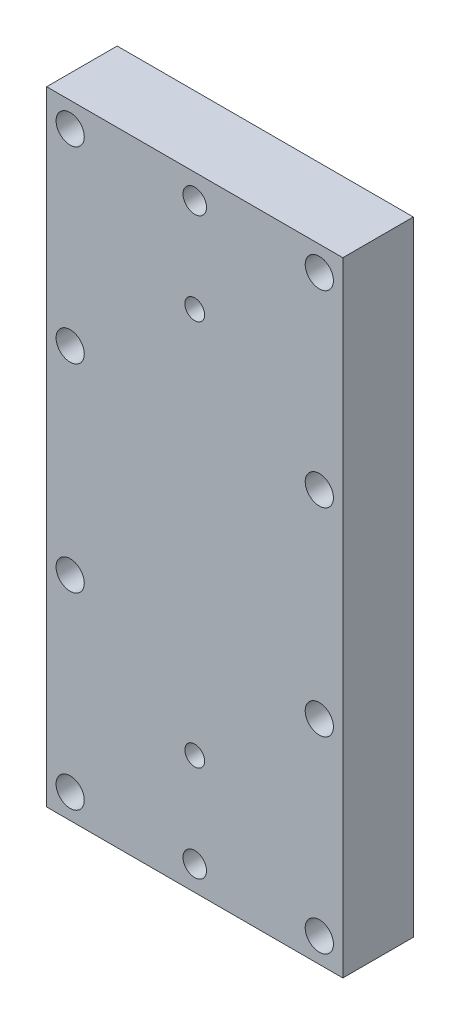
ISO-10303-21;
HEADER;
FILE_DESCRIPTION(('STEP AP214'),'2;1');
FILE_NAME('part.step','',(''),(''),'','','');
FILE_SCHEMA(('AUTOMOTIVE_DESIGN { 1 0 10303 214 1 1 1 1 }'));
ENDSEC;
DATA;
#1=APPLICATION_CONTEXT('core data for automotive mechanical design processes');
#2=APPLICATION_PROTOCOL_DEFINITION('international standard','automotive_design',2000,#1);
#3=PRODUCT_CONTEXT('',#1,'mechanical');
#4=PRODUCT('Part','Part','',(#3));
#5=PRODUCT_RELATED_PRODUCT_CATEGORY('part','',(#4));
#6=PRODUCT_DEFINITION_FORMATION('','',#4);
#7=PRODUCT_DEFINITION_CONTEXT('part definition',#1,'design');
#8=PRODUCT_DEFINITION('design','',#6,#7);
#9=PRODUCT_DEFINITION_SHAPE('','',#8);
#10=(LENGTH_UNIT() NAMED_UNIT(*) SI_UNIT(.MILLI.,.METRE.));
#11=(NAMED_UNIT(*) PLANE_ANGLE_UNIT() SI_UNIT($,.RADIAN.));
#12=(NAMED_UNIT(*) SI_UNIT($,.STERADIAN.) SOLID_ANGLE_UNIT());
#13=UNCERTAINTY_MEASURE_WITH_UNIT(LENGTH_MEASURE(1.E-05),#10,'distance_accuracy_value','');
#14=(GEOMETRIC_REPRESENTATION_CONTEXT(3) GLOBAL_UNCERTAINTY_ASSIGNED_CONTEXT((#13)) GLOBAL_UNIT_ASSIGNED_CONTEXT((#10,
#11,#12)) REPRESENTATION_CONTEXT('',''));
#15=CARTESIAN_POINT('',(0.,0.,0.));
#16=DIRECTION('',(0.,0.,1.));
#17=DIRECTION('',(1.,0.,0.));
#18=AXIS2_PLACEMENT_3D('',#15,#16,#17);
#19=CARTESIAN_POINT('',(26.5,102.2,161.895507079012));
#20=DIRECTION('',(0.,0.,-1.));
#21=DIRECTION('',(-1.,0.,0.));
#22=AXIS2_PLACEMENT_3D('',#19,#20,#21);
#23=CYLINDRICAL_SURFACE('',#22,3.);
#24=CARTESIAN_POINT('',(26.5,102.2,0.));
#25=DIRECTION('',(0.,0.,1.));
#26=DIRECTION('',(1.,0.,0.));
#27=AXIS2_PLACEMENT_3D('',#24,#25,#26);
#28=CIRCLE('',#27,3.);
#29=CARTESIAN_POINT('',(29.5,102.2,0.));
#30=VERTEX_POINT('',#29);
#31=EDGE_CURVE('E114',#30,#30,#28,.T.);
#32=ORIENTED_EDGE('',*,*,#31,.F.);
#33=EDGE_LOOP('',(#32));
#34=FACE_BOUND('',#33,.T.);
#35=CARTESIAN_POINT('',(26.5,102.2,15.));
#36=DIRECTION('',(0.,0.,1.));
#37=DIRECTION('',(1.,0.,0.));
#38=AXIS2_PLACEMENT_3D('',#35,#36,#37);
#39=CIRCLE('',#38,3.);
#40=CARTESIAN_POINT('',(29.5,102.2,15.));
#41=VERTEX_POINT('',#40);
#42=EDGE_CURVE('E140',#41,#41,#39,.T.);
#43=ORIENTED_EDGE('',*,*,#42,.T.);
#44=EDGE_LOOP('',(#43));
#45=FACE_BOUND('',#44,.T.);
#46=ADVANCED_FACE('F41',(#34,#45),#23,.F.);
#47=CARTESIAN_POINT('',(26.5,62.2,161.895507079012));
#48=DIRECTION('',(0.,0.,-1.));
#49=DIRECTION('',(-1.,0.,0.));
#50=AXIS2_PLACEMENT_3D('',#47,#48,#49);
#51=CYLINDRICAL_SURFACE('',#50,3.);
#52=CARTESIAN_POINT('',(26.5,62.2,0.));
#53=DIRECTION('',(0.,0.,1.));
#54=DIRECTION('',(1.,0.,0.));
#55=AXIS2_PLACEMENT_3D('',#52,#53,#54);
#56=CIRCLE('',#55,3.);
#57=CARTESIAN_POINT('',(29.5,62.2,0.));
#58=VERTEX_POINT('',#57);
#59=EDGE_CURVE('E117',#58,#58,#56,.T.);
#60=ORIENTED_EDGE('',*,*,#59,.F.);
#61=EDGE_LOOP('',(#60));
#62=FACE_BOUND('',#61,.T.);
#63=CARTESIAN_POINT('',(26.5,62.2,15.));
#64=DIRECTION('',(0.,0.,1.));
#65=DIRECTION('',(1.,0.,0.));
#66=AXIS2_PLACEMENT_3D('',#63,#64,#65);
#67=CIRCLE('',#66,3.);
#68=CARTESIAN_POINT('',(29.5,62.2,15.));
#69=VERTEX_POINT('',#68);
#70=EDGE_CURVE('E143',#69,#69,#67,.T.);
#71=ORIENTED_EDGE('',*,*,#70,.T.);
#72=EDGE_LOOP('',(#71));
#73=FACE_BOUND('',#72,.T.);
#74=ADVANCED_FACE('F231',(#62,#73),#51,.F.);
#75=CARTESIAN_POINT('',(-26.5,62.2,161.895507079012));
#76=DIRECTION('',(0.,0.,-1.));
#77=DIRECTION('',(-1.,0.,0.));
#78=AXIS2_PLACEMENT_3D('',#75,#76,#77);
#79=CYLINDRICAL_SURFACE('',#78,3.);
#80=CARTESIAN_POINT('',(-26.5,62.2,0.));
#81=DIRECTION('',(0.,0.,1.));
#82=DIRECTION('',(1.,0.,0.));
#83=AXIS2_PLACEMENT_3D('',#80,#81,#82);
#84=CIRCLE('',#83,3.);
#85=CARTESIAN_POINT('',(-23.5,62.2,0.));
#86=VERTEX_POINT('',#85);
#87=EDGE_CURVE('E122',#86,#86,#84,.T.);
#88=ORIENTED_EDGE('',*,*,#87,.F.);
#89=EDGE_LOOP('',(#88));
#90=FACE_BOUND('',#89,.T.);
#91=CARTESIAN_POINT('',(-26.5,62.2,15.));
#92=DIRECTION('',(0.,0.,1.));
#93=DIRECTION('',(1.,0.,0.));
#94=AXIS2_PLACEMENT_3D('',#91,#92,#93);
#95=CIRCLE('',#94,3.);
#96=CARTESIAN_POINT('',(-23.5,62.2,15.));
#97=VERTEX_POINT('',#96);
#98=EDGE_CURVE('E146',#97,#97,#95,.T.);
#99=ORIENTED_EDGE('',*,*,#98,.T.);
#100=EDGE_LOOP('',(#99));
#101=FACE_BOUND('',#100,.T.);
#102=ADVANCED_FACE('F237',(#90,#101),#79,.F.);
#103=CARTESIAN_POINT('',(-26.5,102.2,161.895507079012));
#104=DIRECTION('',(0.,0.,-1.));
#105=DIRECTION('',(-1.,0.,0.));
#106=AXIS2_PLACEMENT_3D('',#103,#104,#105);
#107=CYLINDRICAL_SURFACE('',#106,3.);
#108=CARTESIAN_POINT('',(-26.5,102.2,0.));
#109=DIRECTION('',(0.,0.,1.));
#110=DIRECTION('',(1.,0.,0.));
#111=AXIS2_PLACEMENT_3D('',#108,#109,#110);
#112=CIRCLE('',#111,3.);
#113=CARTESIAN_POINT('',(-23.5,102.2,0.));
#114=VERTEX_POINT('',#113);
#115=EDGE_CURVE('E125',#114,#114,#112,.T.);
#116=ORIENTED_EDGE('',*,*,#115,.F.);
#117=EDGE_LOOP('',(#116));
#118=FACE_BOUND('',#117,.T.);
#119=CARTESIAN_POINT('',(-26.5,102.2,15.));
#120=DIRECTION('',(0.,0.,1.));
#121=DIRECTION('',(1.,0.,0.));
#122=AXIS2_PLACEMENT_3D('',#119,#120,#121);
#123=CIRCLE('',#122,3.);
#124=CARTESIAN_POINT('',(-23.5,102.2,15.));
#125=VERTEX_POINT('',#124);
#126=EDGE_CURVE('E149',#125,#125,#123,.T.);
#127=ORIENTED_EDGE('',*,*,#126,.T.);
#128=EDGE_LOOP('',(#127));
#129=FACE_BOUND('',#128,.T.);
#130=ADVANCED_FACE('F247',(#118,#129),#107,.F.);
#131=CARTESIAN_POINT('',(26.5,20.,161.895507079012));
#132=DIRECTION('',(0.,0.,-1.));
#133=DIRECTION('',(-1.,0.,0.));
#134=AXIS2_PLACEMENT_3D('',#131,#132,#133);
#135=CYLINDRICAL_SURFACE('',#134,3.);
#136=CARTESIAN_POINT('',(26.5,20.,0.));
#137=DIRECTION('',(0.,0.,1.));
#138=DIRECTION('',(1.,0.,0.));
#139=AXIS2_PLACEMENT_3D('',#136,#137,#138);
#140=CIRCLE('',#139,3.);
#141=CARTESIAN_POINT('',(29.5,20.,0.));
#142=VERTEX_POINT('',#141);
#143=EDGE_CURVE('E128',#142,#142,#140,.T.);
#144=ORIENTED_EDGE('',*,*,#143,.F.);
#145=EDGE_LOOP('',(#144));
#146=FACE_BOUND('',#145,.T.);
#147=CARTESIAN_POINT('',(26.5,20.,15.));
#148=DIRECTION('',(0.,0.,1.));
#149=DIRECTION('',(1.,0.,0.));
#150=AXIS2_PLACEMENT_3D('',#147,#148,#149);
#151=CIRCLE('',#150,3.);
#152=CARTESIAN_POINT('',(29.5,20.,15.));
#153=VERTEX_POINT('',#152);
#154=EDGE_CURVE('E152',#153,#153,#151,.T.);
#155=ORIENTED_EDGE('',*,*,#154,.T.);
#156=EDGE_LOOP('',(#155));
#157=FACE_BOUND('',#156,.T.);
#158=ADVANCED_FACE('F251',(#146,#157),#135,.F.);
#159=CARTESIAN_POINT('',(26.5,-20.,161.895507079012));
#160=DIRECTION('',(0.,0.,-1.));
#161=DIRECTION('',(-1.,0.,0.));
#162=AXIS2_PLACEMENT_3D('',#159,#160,#161);
#163=CYLINDRICAL_SURFACE('',#162,3.);
#164=CARTESIAN_POINT('',(26.5,-20.,0.));
#165=DIRECTION('',(0.,0.,1.));
#166=DIRECTION('',(1.,0.,0.));
#167=AXIS2_PLACEMENT_3D('',#164,#165,#166);
#168=CIRCLE('',#167,3.);
#169=CARTESIAN_POINT('',(29.5,-20.,0.));
#170=VERTEX_POINT('',#169);
#171=EDGE_CURVE('E131',#170,#170,#168,.T.);
#172=ORIENTED_EDGE('',*,*,#171,.F.);
#173=EDGE_LOOP('',(#172));
#174=FACE_BOUND('',#173,.T.);
#175=CARTESIAN_POINT('',(26.5,-20.,15.));
#176=DIRECTION('',(0.,0.,1.));
#177=DIRECTION('',(1.,0.,0.));
#178=AXIS2_PLACEMENT_3D('',#175,#176,#177);
#179=CIRCLE('',#178,3.);
#180=CARTESIAN_POINT('',(29.5,-20.,15.));
#181=VERTEX_POINT('',#180);
#182=EDGE_CURVE('E155',#181,#181,#179,.T.);
#183=ORIENTED_EDGE('',*,*,#182,.T.);
#184=EDGE_LOOP('',(#183));
#185=FACE_BOUND('',#184,.T.);
#186=ADVANCED_FACE('F227',(#174,#185),#163,.F.);
#187=CARTESIAN_POINT('',(-26.5,-20.,161.895507079012));
#188=DIRECTION('',(0.,0.,-1.));
#189=DIRECTION('',(-1.,0.,0.));
#190=AXIS2_PLACEMENT_3D('',#187,#188,#189);
#191=CYLINDRICAL_SURFACE('',#190,3.);
#192=CARTESIAN_POINT('',(-26.5,-20.,0.));
#193=DIRECTION('',(0.,0.,1.));
#194=DIRECTION('',(1.,0.,0.));
#195=AXIS2_PLACEMENT_3D('',#192,#193,#194);
#196=CIRCLE('',#195,3.);
#197=CARTESIAN_POINT('',(-23.5,-20.,0.));
#198=VERTEX_POINT('',#197);
#199=EDGE_CURVE('E134',#198,#198,#196,.T.);
#200=ORIENTED_EDGE('',*,*,#199,.F.);
#201=EDGE_LOOP('',(#200));
#202=FACE_BOUND('',#201,.T.);
#203=CARTESIAN_POINT('',(-26.5,-20.,15.));
#204=DIRECTION('',(0.,0.,1.));
#205=DIRECTION('',(1.,0.,0.));
#206=AXIS2_PLACEMENT_3D('',#203,#204,#205);
#207=CIRCLE('',#206,3.);
#208=CARTESIAN_POINT('',(-23.5,-20.,15.));
#209=VERTEX_POINT('',#208);
#210=EDGE_CURVE('E158',#209,#209,#207,.T.);
#211=ORIENTED_EDGE('',*,*,#210,.T.);
#212=EDGE_LOOP('',(#211));
#213=FACE_BOUND('',#212,.T.);
#214=ADVANCED_FACE('F219',(#202,#213),#191,.F.);
#215=CARTESIAN_POINT('',(-26.5,20.,161.895507079012));
#216=DIRECTION('',(0.,0.,-1.));
#217=DIRECTION('',(-1.,0.,0.));
#218=AXIS2_PLACEMENT_3D('',#215,#216,#217);
#219=CYLINDRICAL_SURFACE('',#218,3.);
#220=CARTESIAN_POINT('',(-26.5,20.,0.));
#221=DIRECTION('',(0.,0.,1.));
#222=DIRECTION('',(1.,0.,0.));
#223=AXIS2_PLACEMENT_3D('',#220,#221,#222);
#224=CIRCLE('',#223,3.);
#225=CARTESIAN_POINT('',(-23.5,20.,0.));
#226=VERTEX_POINT('',#225);
#227=EDGE_CURVE('E137',#226,#226,#224,.T.);
#228=ORIENTED_EDGE('',*,*,#227,.F.);
#229=EDGE_LOOP('',(#228));
#230=FACE_BOUND('',#229,.T.);
#231=CARTESIAN_POINT('',(-26.5,20.,15.));
#232=DIRECTION('',(0.,0.,1.));
#233=DIRECTION('',(1.,0.,0.));
#234=AXIS2_PLACEMENT_3D('',#231,#232,#233);
#235=CIRCLE('',#234,3.);
#236=CARTESIAN_POINT('',(-23.5,20.,15.));
#237=VERTEX_POINT('',#236);
#238=EDGE_CURVE('E87',#237,#237,#235,.T.);
#239=ORIENTED_EDGE('',*,*,#238,.T.);
#240=EDGE_LOOP('',(#239));
#241=FACE_BOUND('',#240,.T.);
#242=ADVANCED_FACE('F43',(#230,#241),#219,.F.);
#243=CARTESIAN_POINT('',(0.,0.,0.));
#244=DIRECTION('',(0.,0.,1.));
#245=DIRECTION('',(1.,0.,0.));
#246=AXIS2_PLACEMENT_3D('',#243,#244,#245);
#247=PLANE('',#246);
#248=CARTESIAN_POINT('',(0.,102.2,0.));
#249=DIRECTION('',(0.,0.,1.));
#250=DIRECTION('',(1.,0.,0.));
#251=AXIS2_PLACEMENT_3D('',#248,#249,#250);
#252=CIRCLE('',#251,2.49999999999999);
#253=CARTESIAN_POINT('',(2.50000000000001,102.2,0.));
#254=VERTEX_POINT('',#253);
#255=EDGE_CURVE('E183',#254,#254,#252,.T.);
#256=ORIENTED_EDGE('',*,*,#255,.T.);
#257=EDGE_LOOP('',(#256));
#258=FACE_BOUND('',#257,.T.);
#259=CARTESIAN_POINT('',(0.,-20.,0.));
#260=DIRECTION('',(0.,0.,1.));
#261=DIRECTION('',(1.,0.,0.));
#262=AXIS2_PLACEMENT_3D('',#259,#260,#261);
#263=CIRCLE('',#262,2.49999999999999);
#264=CARTESIAN_POINT('',(2.5,-20.,0.));
#265=VERTEX_POINT('',#264);
#266=EDGE_CURVE('E177',#265,#265,#263,.T.);
#267=ORIENTED_EDGE('',*,*,#266,.T.);
#268=EDGE_LOOP('',(#267));
#269=FACE_BOUND('',#268,.T.);
#270=CARTESIAN_POINT('',(1.40512601554121E-13,82.1999999999995,0.));
#271=DIRECTION('',(0.,0.,1.));
#272=DIRECTION('',(1.,0.,0.));
#273=AXIS2_PLACEMENT_3D('',#270,#271,#272);
#274=CIRCLE('',#273,2.09999999999999);
#275=CARTESIAN_POINT('',(2.10000000000013,82.1999999999995,0.));
#276=VERTEX_POINT('',#275);
#277=EDGE_CURVE('E171',#276,#276,#274,.T.);
#278=ORIENTED_EDGE('',*,*,#277,.T.);
#279=EDGE_LOOP('',(#278));
#280=FACE_BOUND('',#279,.T.);
#281=CARTESIAN_POINT('',(1.31838984174237E-13,-4.85722573273506E-13,0.));
#282=DIRECTION('',(0.,0.,1.));
#283=DIRECTION('',(1.,0.,0.));
#284=AXIS2_PLACEMENT_3D('',#281,#282,#283);
#285=CIRCLE('',#284,2.09999999999999);
#286=CARTESIAN_POINT('',(2.10000000000012,-4.85722573273506E-13,0.));
#287=VERTEX_POINT('',#286);
#288=EDGE_CURVE('E165',#287,#287,#285,.T.);
#289=ORIENTED_EDGE('',*,*,#288,.T.);
#290=EDGE_LOOP('',(#289));
#291=FACE_BOUND('',#290,.T.);
#292=ORIENTED_EDGE('',*,*,#227,.T.);
#293=EDGE_LOOP('',(#292));
#294=FACE_BOUND('',#293,.T.);
#295=ORIENTED_EDGE('',*,*,#199,.T.);
#296=EDGE_LOOP('',(#295));
#297=FACE_BOUND('',#296,.T.);
#298=ORIENTED_EDGE('',*,*,#171,.T.);
#299=EDGE_LOOP('',(#298));
#300=FACE_BOUND('',#299,.T.);
#301=ORIENTED_EDGE('',*,*,#143,.T.);
#302=EDGE_LOOP('',(#301));
#303=FACE_BOUND('',#302,.T.);
#304=ORIENTED_EDGE('',*,*,#115,.T.);
#305=EDGE_LOOP('',(#304));
#306=FACE_BOUND('',#305,.T.);
#307=ORIENTED_EDGE('',*,*,#87,.T.);
#308=EDGE_LOOP('',(#307));
#309=FACE_BOUND('',#308,.T.);
#310=ORIENTED_EDGE('',*,*,#59,.T.);
#311=EDGE_LOOP('',(#310));
#312=FACE_BOUND('',#311,.T.);
#313=ORIENTED_EDGE('',*,*,#31,.T.);
#314=EDGE_LOOP('',(#313));
#315=FACE_BOUND('',#314,.T.);
#316=DIRECTION('',(-1.,0.,0.));
#317=VECTOR('',#316,1.);
#318=CARTESIAN_POINT('',(0.,107.45,0.));
#319=LINE('',#318,#317);
#320=CARTESIAN_POINT('',(31.5,107.45,0.));
#321=VERTEX_POINT('',#320);
#322=CARTESIAN_POINT('',(-31.5,107.45,0.));
#323=VERTEX_POINT('',#322);
#324=EDGE_CURVE('E111',#321,#323,#319,.T.);
#325=ORIENTED_EDGE('',*,*,#324,.F.);
#326=DIRECTION('',(0.,-1.,0.));
#327=VECTOR('',#326,1.);
#328=CARTESIAN_POINT('',(31.5,0.,0.));
#329=LINE('',#328,#327);
#330=CARTESIAN_POINT('',(31.5,-25.25,0.));
#331=VERTEX_POINT('',#330);
#332=EDGE_CURVE('E93',#321,#331,#329,.T.);
#333=ORIENTED_EDGE('',*,*,#332,.T.);
#334=DIRECTION('',(-1.,0.,0.));
#335=VECTOR('',#334,1.);
#336=CARTESIAN_POINT('',(0.,-25.25,0.));
#337=LINE('',#336,#335);
#338=CARTESIAN_POINT('',(-31.5,-25.25,0.));
#339=VERTEX_POINT('',#338);
#340=EDGE_CURVE('E98',#331,#339,#337,.T.);
#341=ORIENTED_EDGE('',*,*,#340,.T.);
#342=DIRECTION('',(0.,-1.,0.));
#343=VECTOR('',#342,1.);
#344=CARTESIAN_POINT('',(-31.5,0.,0.));
#345=LINE('',#344,#343);
#346=EDGE_CURVE('E107',#323,#339,#345,.T.);
#347=ORIENTED_EDGE('',*,*,#346,.F.);
#348=EDGE_LOOP('',(#325,#333,#341,#347));
#349=FACE_BOUND('',#348,.T.);
#350=ADVANCED_FACE('F110',(#258,#269,#280,#291,#294,#297,#300,#303,#306,#309,#312,#315,#349),
#247,.F.);
#351=CARTESIAN_POINT('',(31.5,0.,161.895507079012));
#352=DIRECTION('',(1.,0.,0.));
#353=DIRECTION('',(0.,0.,-1.));
#354=AXIS2_PLACEMENT_3D('',#351,#352,#353);
#355=PLANE('',#354);
#356=DIRECTION('',(0.,0.,-1.));
#357=VECTOR('',#356,1.);
#358=CARTESIAN_POINT('',(31.5,107.45,161.895507079012));
#359=LINE('',#358,#357);
#360=CARTESIAN_POINT('',(31.5,107.45,15.));
#361=VERTEX_POINT('',#360);
#362=EDGE_CURVE('E64',#361,#321,#359,.T.);
#363=ORIENTED_EDGE('',*,*,#362,.F.);
#364=DIRECTION('',(0.,-1.,0.));
#365=VECTOR('',#364,1.);
#366=CARTESIAN_POINT('',(31.5,0.,15.));
#367=LINE('',#366,#365);
#368=CARTESIAN_POINT('',(31.5,-25.25,15.));
#369=VERTEX_POINT('',#368);
#370=EDGE_CURVE('E11',#361,#369,#367,.T.);
#371=ORIENTED_EDGE('',*,*,#370,.T.);
#372=DIRECTION('',(0.,0.,-1.));
#373=VECTOR('',#372,1.);
#374=CARTESIAN_POINT('',(31.5,-25.25,161.895507079012));
#375=LINE('',#374,#373);
#376=EDGE_CURVE('E94',#369,#331,#375,.T.);
#377=ORIENTED_EDGE('',*,*,#376,.T.);
#378=ORIENTED_EDGE('',*,*,#332,.F.);
#379=EDGE_LOOP('',(#363,#371,#377,#378));
#380=FACE_BOUND('',#379,.T.);
#381=ADVANCED_FACE('F91',(#380),#355,.T.);
#382=CARTESIAN_POINT('',(0.,-25.25,161.895507079012));
#383=DIRECTION('',(0.,-1.,0.));
#384=DIRECTION('',(0.,0.,-1.));
#385=AXIS2_PLACEMENT_3D('',#382,#383,#384);
#386=PLANE('',#385);
#387=ORIENTED_EDGE('',*,*,#376,.F.);
#388=DIRECTION('',(-1.,0.,0.));
#389=VECTOR('',#388,1.);
#390=CARTESIAN_POINT('',(0.,-25.25,15.));
#391=LINE('',#390,#389);
#392=CARTESIAN_POINT('',(-31.5,-25.25,15.));
#393=VERTEX_POINT('',#392);
#394=EDGE_CURVE('E56',#369,#393,#391,.T.);
#395=ORIENTED_EDGE('',*,*,#394,.T.);
#396=DIRECTION('',(0.,0.,-1.));
#397=VECTOR('',#396,1.);
#398=CARTESIAN_POINT('',(-31.5,-25.25,161.895507079012));
#399=LINE('',#398,#397);
#400=EDGE_CURVE('E96',#393,#339,#399,.T.);
#401=ORIENTED_EDGE('',*,*,#400,.T.);
#402=ORIENTED_EDGE('',*,*,#340,.F.);
#403=EDGE_LOOP('',(#387,#395,#401,#402));
#404=FACE_BOUND('',#403,.T.);
#405=ADVANCED_FACE('F296',(#404),#386,.T.);
#406=CARTESIAN_POINT('',(-31.5,0.,161.895507079012));
#407=DIRECTION('',(1.,0.,0.));
#408=DIRECTION('',(0.,0.,-1.));
#409=AXIS2_PLACEMENT_3D('',#406,#407,#408);
#410=PLANE('',#409);
#411=DIRECTION('',(0.,-1.,0.));
#412=VECTOR('',#411,1.);
#413=CARTESIAN_POINT('',(-31.5,0.,15.));
#414=LINE('',#413,#412);
#415=CARTESIAN_POINT('',(-31.5,107.45,15.));
#416=VERTEX_POINT('',#415);
#417=EDGE_CURVE('E88',#416,#393,#414,.T.);
#418=ORIENTED_EDGE('',*,*,#417,.F.);
#419=DIRECTION('',(0.,0.,-1.));
#420=VECTOR('',#419,1.);
#421=CARTESIAN_POINT('',(-31.5,107.45,161.895507079012));
#422=LINE('',#421,#420);
#423=EDGE_CURVE('E49',#416,#323,#422,.T.);
#424=ORIENTED_EDGE('',*,*,#423,.T.);
#425=ORIENTED_EDGE('',*,*,#346,.T.);
#426=ORIENTED_EDGE('',*,*,#400,.F.);
#427=EDGE_LOOP('',(#418,#424,#425,#426));
#428=FACE_BOUND('',#427,.T.);
#429=ADVANCED_FACE('F105',(#428),#410,.F.);
#430=CARTESIAN_POINT('',(0.,107.45,161.895507079012));
#431=DIRECTION('',(0.,-1.,0.));
#432=DIRECTION('',(0.,0.,-1.));
#433=AXIS2_PLACEMENT_3D('',#430,#431,#432);
#434=PLANE('',#433);
#435=DIRECTION('',(-1.,0.,0.));
#436=VECTOR('',#435,1.);
#437=CARTESIAN_POINT('',(0.,107.45,15.));
#438=LINE('',#437,#436);
#439=EDGE_CURVE('E82',#361,#416,#438,.T.);
#440=ORIENTED_EDGE('',*,*,#439,.F.);
#441=ORIENTED_EDGE('',*,*,#362,.T.);
#442=ORIENTED_EDGE('',*,*,#324,.T.);
#443=ORIENTED_EDGE('',*,*,#423,.F.);
#444=EDGE_LOOP('',(#440,#441,#442,#443));
#445=FACE_BOUND('',#444,.T.);
#446=ADVANCED_FACE('F85',(#445),#434,.F.);
#447=CARTESIAN_POINT('',(-11.2182809979644,45.6118133743666,15.));
#448=DIRECTION('',(0.,0.,1.));
#449=DIRECTION('',(1.,0.,0.));
#450=AXIS2_PLACEMENT_3D('',#447,#448,#449);
#451=PLANE('',#450);
#452=CARTESIAN_POINT('',(0.,102.2,15.));
#453=DIRECTION('',(0.,0.,1.));
#454=DIRECTION('',(1.,0.,0.));
#455=AXIS2_PLACEMENT_3D('',#452,#453,#454);
#456=CIRCLE('',#455,2.49999999999999);
#457=CARTESIAN_POINT('',(2.50000000000001,102.2,15.));
#458=VERTEX_POINT('',#457);
#459=EDGE_CURVE('E186',#458,#458,#456,.T.);
#460=ORIENTED_EDGE('',*,*,#459,.F.);
#461=EDGE_LOOP('',(#460));
#462=FACE_BOUND('',#461,.T.);
#463=CARTESIAN_POINT('',(0.,-20.,15.));
#464=DIRECTION('',(0.,0.,1.));
#465=DIRECTION('',(1.,0.,0.));
#466=AXIS2_PLACEMENT_3D('',#463,#464,#465);
#467=CIRCLE('',#466,2.49999999999999);
#468=CARTESIAN_POINT('',(2.49999999999999,-20.,15.));
#469=VERTEX_POINT('',#468);
#470=EDGE_CURVE('E180',#469,#469,#467,.T.);
#471=ORIENTED_EDGE('',*,*,#470,.F.);
#472=EDGE_LOOP('',(#471));
#473=FACE_BOUND('',#472,.T.);
#474=CARTESIAN_POINT('',(1.40512601554121E-13,82.1999999999995,15.));
#475=DIRECTION('',(0.,0.,1.));
#476=DIRECTION('',(1.,0.,0.));
#477=AXIS2_PLACEMENT_3D('',#474,#475,#476);
#478=CIRCLE('',#477,2.09999999999999);
#479=CARTESIAN_POINT('',(2.10000000000013,82.1999999999995,15.));
#480=VERTEX_POINT('',#479);
#481=EDGE_CURVE('E174',#480,#480,#478,.T.);
#482=ORIENTED_EDGE('',*,*,#481,.F.);
#483=EDGE_LOOP('',(#482));
#484=FACE_BOUND('',#483,.T.);
#485=CARTESIAN_POINT('',(1.31838984174237E-13,-4.85722573273506E-13,15.));
#486=DIRECTION('',(0.,0.,1.));
#487=DIRECTION('',(1.,0.,0.));
#488=AXIS2_PLACEMENT_3D('',#485,#486,#487);
#489=CIRCLE('',#488,2.09999999999999);
#490=CARTESIAN_POINT('',(2.10000000000012,-4.85722573273506E-13,15.));
#491=VERTEX_POINT('',#490);
#492=EDGE_CURVE('E168',#491,#491,#489,.T.);
#493=ORIENTED_EDGE('',*,*,#492,.F.);
#494=EDGE_LOOP('',(#493));
#495=FACE_BOUND('',#494,.T.);
#496=ORIENTED_EDGE('',*,*,#42,.F.);
#497=EDGE_LOOP('',(#496));
#498=FACE_BOUND('',#497,.T.);
#499=ORIENTED_EDGE('',*,*,#70,.F.);
#500=EDGE_LOOP('',(#499));
#501=FACE_BOUND('',#500,.T.);
#502=ORIENTED_EDGE('',*,*,#98,.F.);
#503=EDGE_LOOP('',(#502));
#504=FACE_BOUND('',#503,.T.);
#505=ORIENTED_EDGE('',*,*,#126,.F.);
#506=EDGE_LOOP('',(#505));
#507=FACE_BOUND('',#506,.T.);
#508=ORIENTED_EDGE('',*,*,#154,.F.);
#509=EDGE_LOOP('',(#508));
#510=FACE_BOUND('',#509,.T.);
#511=ORIENTED_EDGE('',*,*,#182,.F.);
#512=EDGE_LOOP('',(#511));
#513=FACE_BOUND('',#512,.T.);
#514=ORIENTED_EDGE('',*,*,#210,.F.);
#515=EDGE_LOOP('',(#514));
#516=FACE_BOUND('',#515,.T.);
#517=ORIENTED_EDGE('',*,*,#238,.F.);
#518=EDGE_LOOP('',(#517));
#519=FACE_BOUND('',#518,.T.);
#520=ORIENTED_EDGE('',*,*,#370,.F.);
#521=ORIENTED_EDGE('',*,*,#439,.T.);
#522=ORIENTED_EDGE('',*,*,#417,.T.);
#523=ORIENTED_EDGE('',*,*,#394,.F.);
#524=EDGE_LOOP('',(#520,#521,#522,#523));
#525=FACE_BOUND('',#524,.T.);
#526=ADVANCED_FACE('F81',(#462,#473,#484,#495,#498,#501,#504,#507,#510,#513,#516,#519,#525),
#451,.T.);
#527=CARTESIAN_POINT('',(1.31838984174237E-13,-4.85722573273506E-13,15.));
#528=DIRECTION('',(0.,0.,1.));
#529=DIRECTION('',(1.,0.,0.));
#530=AXIS2_PLACEMENT_3D('',#527,#528,#529);
#531=CYLINDRICAL_SURFACE('',#530,2.09999999999999);
#532=ORIENTED_EDGE('',*,*,#288,.F.);
#533=EDGE_LOOP('',(#532));
#534=FACE_BOUND('',#533,.T.);
#535=ORIENTED_EDGE('',*,*,#492,.T.);
#536=EDGE_LOOP('',(#535));
#537=FACE_BOUND('',#536,.T.);
#538=ADVANCED_FACE('F194',(#534,#537),#531,.F.);
#539=CARTESIAN_POINT('',(1.40512601554121E-13,82.1999999999995,15.));
#540=DIRECTION('',(0.,0.,1.));
#541=DIRECTION('',(1.,0.,0.));
#542=AXIS2_PLACEMENT_3D('',#539,#540,#541);
#543=CYLINDRICAL_SURFACE('',#542,2.09999999999999);
#544=ORIENTED_EDGE('',*,*,#277,.F.);
#545=EDGE_LOOP('',(#544));
#546=FACE_BOUND('',#545,.T.);
#547=ORIENTED_EDGE('',*,*,#481,.T.);
#548=EDGE_LOOP('',(#547));
#549=FACE_BOUND('',#548,.T.);
#550=ADVANCED_FACE('F330',(#546,#549),#543,.F.);
#551=CARTESIAN_POINT('',(0.,-20.,15.));
#552=DIRECTION('',(0.,0.,1.));
#553=DIRECTION('',(1.,0.,0.));
#554=AXIS2_PLACEMENT_3D('',#551,#552,#553);
#555=CYLINDRICAL_SURFACE('',#554,2.49999999999999);
#556=ORIENTED_EDGE('',*,*,#266,.F.);
#557=EDGE_LOOP('',(#556));
#558=FACE_BOUND('',#557,.T.);
#559=ORIENTED_EDGE('',*,*,#470,.T.);
#560=EDGE_LOOP('',(#559));
#561=FACE_BOUND('',#560,.T.);
#562=ADVANCED_FACE('F343',(#558,#561),#555,.F.);
#563=CARTESIAN_POINT('',(0.,102.2,15.));
#564=DIRECTION('',(0.,0.,1.));
#565=DIRECTION('',(1.,0.,0.));
#566=AXIS2_PLACEMENT_3D('',#563,#564,#565);
#567=CYLINDRICAL_SURFACE('',#566,2.49999999999999);
#568=ORIENTED_EDGE('',*,*,#255,.F.);
#569=EDGE_LOOP('',(#568));
#570=FACE_BOUND('',#569,.T.);
#571=ORIENTED_EDGE('',*,*,#459,.T.);
#572=EDGE_LOOP('',(#571));
#573=FACE_BOUND('',#572,.T.);
#574=ADVANCED_FACE('F190',(#570,#573),#567,.F.);
#575=CLOSED_SHELL('',(#46,#74,#102,#130,#158,#186,#214,#242,#350,#381,#405,#429,#446,#526,#538,
#550,#562,#574));
#576=MANIFOLD_SOLID_BREP('B2',#575);
#577=ADVANCED_BREP_SHAPE_REPRESENTATION('',(#18,#576),#14);
#578=SHAPE_DEFINITION_REPRESENTATION(#9,#577);
ENDSEC;
END-ISO-10303-21;
